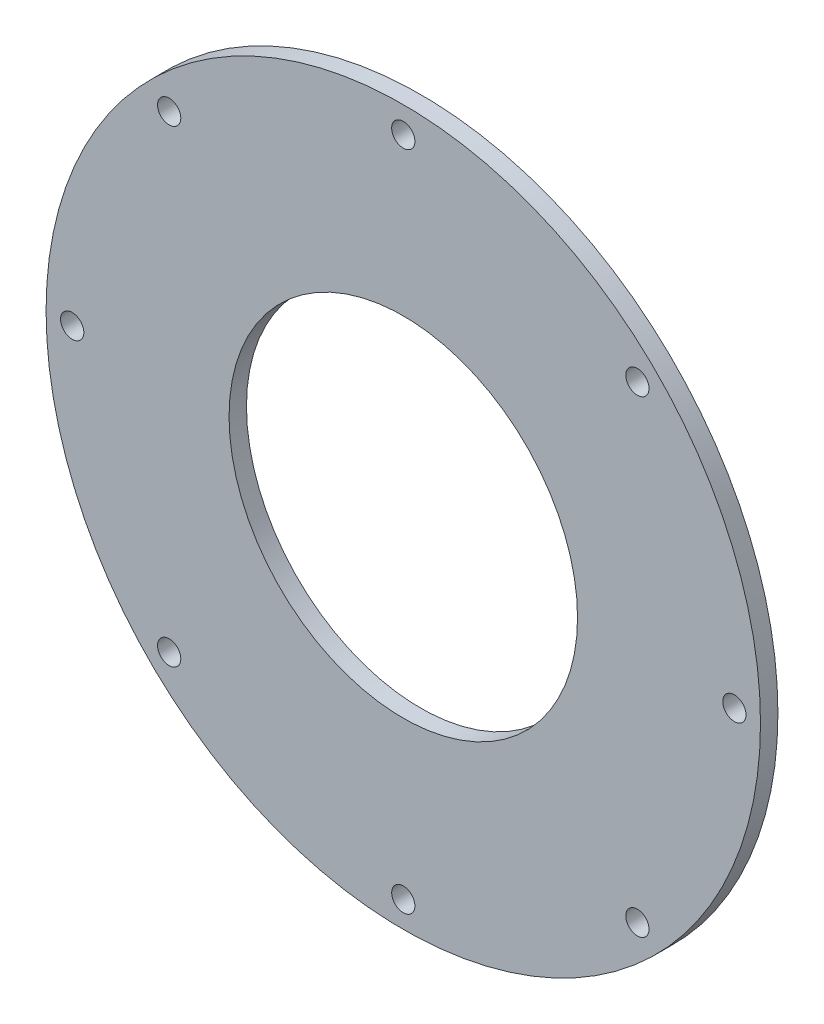
ISO-10303-21;
HEADER;
FILE_DESCRIPTION(('STEP AP214'),'2;1');
FILE_NAME('part.step','',(''),(''),'','','');
FILE_SCHEMA(('AUTOMOTIVE_DESIGN { 1 0 10303 214 1 1 1 1 }'));
ENDSEC;
DATA;
#1=APPLICATION_CONTEXT('core data for automotive mechanical design processes');
#2=APPLICATION_PROTOCOL_DEFINITION('international standard','automotive_design',2000,#1);
#3=PRODUCT_CONTEXT('',#1,'mechanical');
#4=PRODUCT('Part','Part','',(#3));
#5=PRODUCT_RELATED_PRODUCT_CATEGORY('part','',(#4));
#6=PRODUCT_DEFINITION_FORMATION('','',#4);
#7=PRODUCT_DEFINITION_CONTEXT('part definition',#1,'design');
#8=PRODUCT_DEFINITION('design','',#6,#7);
#9=PRODUCT_DEFINITION_SHAPE('','',#8);
#10=(LENGTH_UNIT() NAMED_UNIT(*) SI_UNIT(.MILLI.,.METRE.));
#11=(NAMED_UNIT(*) PLANE_ANGLE_UNIT() SI_UNIT($,.RADIAN.));
#12=(NAMED_UNIT(*) SI_UNIT($,.STERADIAN.) SOLID_ANGLE_UNIT());
#13=UNCERTAINTY_MEASURE_WITH_UNIT(LENGTH_MEASURE(1.E-05),#10,'distance_accuracy_value','');
#14=(GEOMETRIC_REPRESENTATION_CONTEXT(3) GLOBAL_UNCERTAINTY_ASSIGNED_CONTEXT((#13)) GLOBAL_UNIT_ASSIGNED_CONTEXT((#10,
#11,#12)) REPRESENTATION_CONTEXT('',''));
#15=CARTESIAN_POINT('',(0.,0.,0.));
#16=DIRECTION('',(0.,0.,1.));
#17=DIRECTION('',(1.,0.,0.));
#18=AXIS2_PLACEMENT_3D('',#15,#16,#17);
#19=CARTESIAN_POINT('',(0.,0.,3.));
#20=DIRECTION('',(0.,0.,1.));
#21=DIRECTION('',(1.,0.,0.));
#22=AXIS2_PLACEMENT_3D('',#19,#20,#21);
#23=PLANE('',#22);
#24=CARTESIAN_POINT('',(0.,0.,3.));
#25=DIRECTION('',(0.,0.,1.));
#26=DIRECTION('',(1.,0.,0.));
#27=AXIS2_PLACEMENT_3D('',#24,#25,#26);
#28=CIRCLE('',#27,30.);
#29=CARTESIAN_POINT('',(30.,0.,3.));
#30=VERTEX_POINT('',#29);
#31=EDGE_CURVE('E117',#30,#30,#28,.T.);
#32=ORIENTED_EDGE('',*,*,#31,.F.);
#33=EDGE_LOOP('',(#32));
#34=FACE_BOUND('',#33,.T.);
#35=CARTESIAN_POINT('',(57.,-5.96492217882559E-13,3.));
#36=DIRECTION('',(0.,0.,1.));
#37=DIRECTION('',(1.,0.,0.));
#38=AXIS2_PLACEMENT_3D('',#35,#36,#37);
#39=CIRCLE('',#38,2.);
#40=CARTESIAN_POINT('',(59.,-5.96492217882559E-13,3.));
#41=VERTEX_POINT('',#40);
#42=EDGE_CURVE('E98',#41,#41,#39,.T.);
#43=ORIENTED_EDGE('',*,*,#42,.F.);
#44=EDGE_LOOP('',(#43));
#45=FACE_BOUND('',#44,.T.);
#46=CARTESIAN_POINT('',(3.97477781568501E-13,57.,3.));
#47=DIRECTION('',(0.,0.,1.));
#48=DIRECTION('',(1.,0.,0.));
#49=AXIS2_PLACEMENT_3D('',#46,#47,#48);
#50=CIRCLE('',#49,2.);
#51=CARTESIAN_POINT('',(2.0000000000004,57.,3.));
#52=VERTEX_POINT('',#51);
#53=EDGE_CURVE('E82',#52,#52,#50,.T.);
#54=ORIENTED_EDGE('',*,*,#53,.F.);
#55=EDGE_LOOP('',(#54));
#56=FACE_BOUND('',#55,.T.);
#57=CARTESIAN_POINT('',(-57.,1.00835959934104E-12,3.));
#58=DIRECTION('',(0.,0.,1.));
#59=DIRECTION('',(1.,0.,0.));
#60=AXIS2_PLACEMENT_3D('',#57,#58,#59);
#61=CIRCLE('',#60,2.);
#62=CARTESIAN_POINT('',(-55.,1.00835959934104E-12,3.));
#63=VERTEX_POINT('',#62);
#64=EDGE_CURVE('E66',#63,#63,#61,.T.);
#65=ORIENTED_EDGE('',*,*,#64,.F.);
#66=EDGE_LOOP('',(#65));
#67=FACE_BOUND('',#66,.T.);
#68=CARTESIAN_POINT('',(0.,-57.,3.));
#69=DIRECTION('',(0.,0.,1.));
#70=DIRECTION('',(1.,0.,0.));
#71=AXIS2_PLACEMENT_3D('',#68,#69,#70);
#72=CIRCLE('',#71,2.);
#73=CARTESIAN_POINT('',(2.,-57.,3.));
#74=VERTEX_POINT('',#73);
#75=EDGE_CURVE('E52',#74,#74,#72,.T.);
#76=ORIENTED_EDGE('',*,*,#75,.F.);
#77=EDGE_LOOP('',(#76));
#78=FACE_BOUND('',#77,.T.);
#79=CARTESIAN_POINT('',(0.,0.,3.));
#80=DIRECTION('',(0.,0.,1.));
#81=DIRECTION('',(1.,0.,0.));
#82=AXIS2_PLACEMENT_3D('',#79,#80,#81);
#83=CIRCLE('',#82,61.5);
#84=CARTESIAN_POINT('',(61.5,0.,3.));
#85=VERTEX_POINT('',#84);
#86=EDGE_CURVE('E10',#85,#85,#83,.T.);
#87=ORIENTED_EDGE('',*,*,#86,.T.);
#88=EDGE_LOOP('',(#87));
#89=FACE_BOUND('',#88,.T.);
#90=CARTESIAN_POINT('',(-40.3050865276338,-40.3050865276326,3.));
#91=DIRECTION('',(0.,0.,1.));
#92=DIRECTION('',(1.,0.,0.));
#93=AXIS2_PLACEMENT_3D('',#90,#91,#92);
#94=CIRCLE('',#93,2.00000000000001);
#95=CARTESIAN_POINT('',(-38.3050865276338,-40.3050865276326,3.));
#96=VERTEX_POINT('',#95);
#97=EDGE_CURVE('E58',#96,#96,#94,.T.);
#98=ORIENTED_EDGE('',*,*,#97,.F.);
#99=EDGE_LOOP('',(#98));
#100=FACE_BOUND('',#99,.T.);
#101=CARTESIAN_POINT('',(-40.305086527633,40.3050865276334,3.));
#102=DIRECTION('',(0.,0.,1.));
#103=DIRECTION('',(1.,0.,0.));
#104=AXIS2_PLACEMENT_3D('',#101,#102,#103);
#105=CIRCLE('',#104,2.00000000000001);
#106=CARTESIAN_POINT('',(-38.305086527633,40.3050865276334,3.));
#107=VERTEX_POINT('',#106);
#108=EDGE_CURVE('E74',#107,#107,#105,.T.);
#109=ORIENTED_EDGE('',*,*,#108,.F.);
#110=EDGE_LOOP('',(#109));
#111=FACE_BOUND('',#110,.T.);
#112=CARTESIAN_POINT('',(40.3050865276336,40.3050865276329,3.));
#113=DIRECTION('',(0.,0.,1.));
#114=DIRECTION('',(1.,0.,0.));
#115=AXIS2_PLACEMENT_3D('',#112,#113,#114);
#116=CIRCLE('',#115,2.00000000000001);
#117=CARTESIAN_POINT('',(42.3050865276336,40.3050865276329,3.));
#118=VERTEX_POINT('',#117);
#119=EDGE_CURVE('E90',#118,#118,#116,.T.);
#120=ORIENTED_EDGE('',*,*,#119,.F.);
#121=EDGE_LOOP('',(#120));
#122=FACE_BOUND('',#121,.T.);
#123=CARTESIAN_POINT('',(40.3050865276327,-40.3050865276337,3.));
#124=DIRECTION('',(0.,0.,1.));
#125=DIRECTION('',(1.,0.,0.));
#126=AXIS2_PLACEMENT_3D('',#123,#124,#125);
#127=CIRCLE('',#126,2.00000000000001);
#128=CARTESIAN_POINT('',(42.3050865276327,-40.3050865276337,3.));
#129=VERTEX_POINT('',#128);
#130=EDGE_CURVE('E106',#129,#129,#127,.T.);
#131=ORIENTED_EDGE('',*,*,#130,.F.);
#132=EDGE_LOOP('',(#131));
#133=FACE_BOUND('',#132,.T.);
#134=ADVANCED_FACE('F37',(#34,#45,#56,#67,#78,#89,#100,#111,#122,#133),#23,.T.);
#135=CARTESIAN_POINT('',(0.,0.,0.));
#136=DIRECTION('',(0.,0.,1.));
#137=DIRECTION('',(1.,0.,0.));
#138=AXIS2_PLACEMENT_3D('',#135,#136,#137);
#139=PLANE('',#138);
#140=CARTESIAN_POINT('',(0.,0.,0.));
#141=DIRECTION('',(0.,0.,1.));
#142=DIRECTION('',(1.,0.,0.));
#143=AXIS2_PLACEMENT_3D('',#140,#141,#142);
#144=CIRCLE('',#143,30.);
#145=CARTESIAN_POINT('',(30.,0.,0.));
#146=VERTEX_POINT('',#145);
#147=EDGE_CURVE('E41',#146,#146,#144,.T.);
#148=ORIENTED_EDGE('',*,*,#147,.T.);
#149=EDGE_LOOP('',(#148));
#150=FACE_BOUND('',#149,.T.);
#151=CARTESIAN_POINT('',(0.,0.,0.));
#152=DIRECTION('',(0.,0.,1.));
#153=DIRECTION('',(1.,0.,0.));
#154=AXIS2_PLACEMENT_3D('',#151,#152,#153);
#155=CIRCLE('',#154,61.5);
#156=CARTESIAN_POINT('',(61.5,0.,0.));
#157=VERTEX_POINT('',#156);
#158=EDGE_CURVE('E46',#157,#157,#155,.T.);
#159=ORIENTED_EDGE('',*,*,#158,.F.);
#160=EDGE_LOOP('',(#159));
#161=FACE_BOUND('',#160,.T.);
#162=CARTESIAN_POINT('',(0.,-57.,0.));
#163=DIRECTION('',(0.,0.,1.));
#164=DIRECTION('',(1.,0.,0.));
#165=AXIS2_PLACEMENT_3D('',#162,#163,#164);
#166=CIRCLE('',#165,2.);
#167=CARTESIAN_POINT('',(2.,-57.,0.));
#168=VERTEX_POINT('',#167);
#169=EDGE_CURVE('E54',#168,#168,#166,.T.);
#170=ORIENTED_EDGE('',*,*,#169,.T.);
#171=EDGE_LOOP('',(#170));
#172=FACE_BOUND('',#171,.T.);
#173=CARTESIAN_POINT('',(-40.3050865276338,-40.3050865276326,0.));
#174=DIRECTION('',(0.,0.,1.));
#175=DIRECTION('',(1.,0.,0.));
#176=AXIS2_PLACEMENT_3D('',#173,#174,#175);
#177=CIRCLE('',#176,2.00000000000001);
#178=CARTESIAN_POINT('',(-38.3050865276338,-40.3050865276326,0.));
#179=VERTEX_POINT('',#178);
#180=EDGE_CURVE('E62',#179,#179,#177,.T.);
#181=ORIENTED_EDGE('',*,*,#180,.T.);
#182=EDGE_LOOP('',(#181));
#183=FACE_BOUND('',#182,.T.);
#184=CARTESIAN_POINT('',(-57.,1.00835959934104E-12,0.));
#185=DIRECTION('',(0.,0.,1.));
#186=DIRECTION('',(1.,0.,0.));
#187=AXIS2_PLACEMENT_3D('',#184,#185,#186);
#188=CIRCLE('',#187,2.);
#189=CARTESIAN_POINT('',(-55.,1.00835959934104E-12,0.));
#190=VERTEX_POINT('',#189);
#191=EDGE_CURVE('E70',#190,#190,#188,.T.);
#192=ORIENTED_EDGE('',*,*,#191,.T.);
#193=EDGE_LOOP('',(#192));
#194=FACE_BOUND('',#193,.T.);
#195=CARTESIAN_POINT('',(-40.305086527633,40.3050865276334,0.));
#196=DIRECTION('',(0.,0.,1.));
#197=DIRECTION('',(1.,0.,0.));
#198=AXIS2_PLACEMENT_3D('',#195,#196,#197);
#199=CIRCLE('',#198,2.00000000000001);
#200=CARTESIAN_POINT('',(-38.305086527633,40.3050865276334,0.));
#201=VERTEX_POINT('',#200);
#202=EDGE_CURVE('E78',#201,#201,#199,.T.);
#203=ORIENTED_EDGE('',*,*,#202,.T.);
#204=EDGE_LOOP('',(#203));
#205=FACE_BOUND('',#204,.T.);
#206=CARTESIAN_POINT('',(3.97477781568501E-13,57.,0.));
#207=DIRECTION('',(0.,0.,1.));
#208=DIRECTION('',(1.,0.,0.));
#209=AXIS2_PLACEMENT_3D('',#206,#207,#208);
#210=CIRCLE('',#209,2.);
#211=CARTESIAN_POINT('',(2.0000000000004,57.,0.));
#212=VERTEX_POINT('',#211);
#213=EDGE_CURVE('E86',#212,#212,#210,.T.);
#214=ORIENTED_EDGE('',*,*,#213,.T.);
#215=EDGE_LOOP('',(#214));
#216=FACE_BOUND('',#215,.T.);
#217=CARTESIAN_POINT('',(40.3050865276336,40.3050865276329,0.));
#218=DIRECTION('',(0.,0.,1.));
#219=DIRECTION('',(1.,0.,0.));
#220=AXIS2_PLACEMENT_3D('',#217,#218,#219);
#221=CIRCLE('',#220,2.00000000000001);
#222=CARTESIAN_POINT('',(42.3050865276336,40.3050865276329,0.));
#223=VERTEX_POINT('',#222);
#224=EDGE_CURVE('E94',#223,#223,#221,.T.);
#225=ORIENTED_EDGE('',*,*,#224,.T.);
#226=EDGE_LOOP('',(#225));
#227=FACE_BOUND('',#226,.T.);
#228=CARTESIAN_POINT('',(57.,-5.96492217882559E-13,0.));
#229=DIRECTION('',(0.,0.,1.));
#230=DIRECTION('',(1.,0.,0.));
#231=AXIS2_PLACEMENT_3D('',#228,#229,#230);
#232=CIRCLE('',#231,2.);
#233=CARTESIAN_POINT('',(59.,-5.96492217882559E-13,0.));
#234=VERTEX_POINT('',#233);
#235=EDGE_CURVE('E102',#234,#234,#232,.T.);
#236=ORIENTED_EDGE('',*,*,#235,.T.);
#237=EDGE_LOOP('',(#236));
#238=FACE_BOUND('',#237,.T.);
#239=CARTESIAN_POINT('',(40.3050865276327,-40.3050865276337,0.));
#240=DIRECTION('',(0.,0.,1.));
#241=DIRECTION('',(1.,0.,0.));
#242=AXIS2_PLACEMENT_3D('',#239,#240,#241);
#243=CIRCLE('',#242,2.00000000000001);
#244=CARTESIAN_POINT('',(42.3050865276327,-40.3050865276337,0.));
#245=VERTEX_POINT('',#244);
#246=EDGE_CURVE('E110',#245,#245,#243,.T.);
#247=ORIENTED_EDGE('',*,*,#246,.T.);
#248=EDGE_LOOP('',(#247));
#249=FACE_BOUND('',#248,.T.);
#250=ADVANCED_FACE('F126',(#150,#161,#172,#183,#194,#205,#216,#227,#238,#249),#139,.F.);
#251=CARTESIAN_POINT('',(0.,0.,3.));
#252=DIRECTION('',(0.,0.,-1.));
#253=DIRECTION('',(-1.,0.,0.));
#254=AXIS2_PLACEMENT_3D('',#251,#252,#253);
#255=CYLINDRICAL_SURFACE('',#254,61.5);
#256=ORIENTED_EDGE('',*,*,#86,.F.);
#257=EDGE_LOOP('',(#256));
#258=FACE_BOUND('',#257,.T.);
#259=ORIENTED_EDGE('',*,*,#158,.T.);
#260=EDGE_LOOP('',(#259));
#261=FACE_BOUND('',#260,.T.);
#262=ADVANCED_FACE('F39',(#258,#261),#255,.T.);
#263=CARTESIAN_POINT('',(0.,-57.,3.));
#264=DIRECTION('',(0.,0.,-1.));
#265=DIRECTION('',(-1.,0.,0.));
#266=AXIS2_PLACEMENT_3D('',#263,#264,#265);
#267=CYLINDRICAL_SURFACE('',#266,2.);
#268=ORIENTED_EDGE('',*,*,#75,.T.);
#269=EDGE_LOOP('',(#268));
#270=FACE_BOUND('',#269,.T.);
#271=ORIENTED_EDGE('',*,*,#169,.F.);
#272=EDGE_LOOP('',(#271));
#273=FACE_BOUND('',#272,.T.);
#274=ADVANCED_FACE('F147',(#270,#273),#267,.F.);
#275=CARTESIAN_POINT('',(-40.3050865276338,-40.3050865276326,3.));
#276=DIRECTION('',(0.,0.,-1.));
#277=DIRECTION('',(-1.,0.,0.));
#278=AXIS2_PLACEMENT_3D('',#275,#276,#277);
#279=CYLINDRICAL_SURFACE('',#278,2.00000000000001);
#280=ORIENTED_EDGE('',*,*,#97,.T.);
#281=EDGE_LOOP('',(#280));
#282=FACE_BOUND('',#281,.T.);
#283=ORIENTED_EDGE('',*,*,#180,.F.);
#284=EDGE_LOOP('',(#283));
#285=FACE_BOUND('',#284,.T.);
#286=ADVANCED_FACE('F150',(#282,#285),#279,.F.);
#287=CARTESIAN_POINT('',(-57.,1.00835959934104E-12,3.));
#288=DIRECTION('',(0.,0.,-1.));
#289=DIRECTION('',(-1.,0.,0.));
#290=AXIS2_PLACEMENT_3D('',#287,#288,#289);
#291=CYLINDRICAL_SURFACE('',#290,2.);
#292=ORIENTED_EDGE('',*,*,#64,.T.);
#293=EDGE_LOOP('',(#292));
#294=FACE_BOUND('',#293,.T.);
#295=ORIENTED_EDGE('',*,*,#191,.F.);
#296=EDGE_LOOP('',(#295));
#297=FACE_BOUND('',#296,.T.);
#298=ADVANCED_FACE('F154',(#294,#297),#291,.F.);
#299=CARTESIAN_POINT('',(-40.305086527633,40.3050865276334,3.));
#300=DIRECTION('',(0.,0.,-1.));
#301=DIRECTION('',(-1.,0.,0.));
#302=AXIS2_PLACEMENT_3D('',#299,#300,#301);
#303=CYLINDRICAL_SURFACE('',#302,2.00000000000001);
#304=ORIENTED_EDGE('',*,*,#108,.T.);
#305=EDGE_LOOP('',(#304));
#306=FACE_BOUND('',#305,.T.);
#307=ORIENTED_EDGE('',*,*,#202,.F.);
#308=EDGE_LOOP('',(#307));
#309=FACE_BOUND('',#308,.T.);
#310=ADVANCED_FACE('F158',(#306,#309),#303,.F.);
#311=CARTESIAN_POINT('',(3.97477781568501E-13,57.,3.));
#312=DIRECTION('',(0.,0.,-1.));
#313=DIRECTION('',(-1.,0.,0.));
#314=AXIS2_PLACEMENT_3D('',#311,#312,#313);
#315=CYLINDRICAL_SURFACE('',#314,2.);
#316=ORIENTED_EDGE('',*,*,#53,.T.);
#317=EDGE_LOOP('',(#316));
#318=FACE_BOUND('',#317,.T.);
#319=ORIENTED_EDGE('',*,*,#213,.F.);
#320=EDGE_LOOP('',(#319));
#321=FACE_BOUND('',#320,.T.);
#322=ADVANCED_FACE('F162',(#318,#321),#315,.F.);
#323=CARTESIAN_POINT('',(40.3050865276336,40.3050865276329,3.));
#324=DIRECTION('',(0.,0.,-1.));
#325=DIRECTION('',(-1.,0.,0.));
#326=AXIS2_PLACEMENT_3D('',#323,#324,#325);
#327=CYLINDRICAL_SURFACE('',#326,2.00000000000001);
#328=ORIENTED_EDGE('',*,*,#119,.T.);
#329=EDGE_LOOP('',(#328));
#330=FACE_BOUND('',#329,.T.);
#331=ORIENTED_EDGE('',*,*,#224,.F.);
#332=EDGE_LOOP('',(#331));
#333=FACE_BOUND('',#332,.T.);
#334=ADVANCED_FACE('F166',(#330,#333),#327,.F.);
#335=CARTESIAN_POINT('',(57.,-5.96492217882559E-13,3.));
#336=DIRECTION('',(0.,0.,-1.));
#337=DIRECTION('',(-1.,0.,0.));
#338=AXIS2_PLACEMENT_3D('',#335,#336,#337);
#339=CYLINDRICAL_SURFACE('',#338,2.);
#340=ORIENTED_EDGE('',*,*,#42,.T.);
#341=EDGE_LOOP('',(#340));
#342=FACE_BOUND('',#341,.T.);
#343=ORIENTED_EDGE('',*,*,#235,.F.);
#344=EDGE_LOOP('',(#343));
#345=FACE_BOUND('',#344,.T.);
#346=ADVANCED_FACE('F136',(#342,#345),#339,.F.);
#347=CARTESIAN_POINT('',(40.3050865276327,-40.3050865276337,3.));
#348=DIRECTION('',(0.,0.,-1.));
#349=DIRECTION('',(-1.,0.,0.));
#350=AXIS2_PLACEMENT_3D('',#347,#348,#349);
#351=CYLINDRICAL_SURFACE('',#350,2.00000000000001);
#352=ORIENTED_EDGE('',*,*,#130,.T.);
#353=EDGE_LOOP('',(#352));
#354=FACE_BOUND('',#353,.T.);
#355=ORIENTED_EDGE('',*,*,#246,.F.);
#356=EDGE_LOOP('',(#355));
#357=FACE_BOUND('',#356,.T.);
#358=ADVANCED_FACE('F131',(#354,#357),#351,.F.);
#359=CARTESIAN_POINT('',(0.,0.,-7.));
#360=DIRECTION('',(0.,0.,1.));
#361=DIRECTION('',(1.,0.,0.));
#362=AXIS2_PLACEMENT_3D('',#359,#360,#361);
#363=CYLINDRICAL_SURFACE('',#362,30.);
#364=ORIENTED_EDGE('',*,*,#31,.T.);
#365=EDGE_LOOP('',(#364));
#366=FACE_BOUND('',#365,.T.);
#367=ORIENTED_EDGE('',*,*,#147,.F.);
#368=EDGE_LOOP('',(#367));
#369=FACE_BOUND('',#368,.T.);
#370=ADVANCED_FACE('F129',(#366,#369),#363,.F.);
#371=CLOSED_SHELL('',(#134,#250,#262,#274,#286,#298,#310,#322,#334,#346,#358,#370));
#372=MANIFOLD_SOLID_BREP('B2',#371);
#373=ADVANCED_BREP_SHAPE_REPRESENTATION('',(#18,#372),#14);
#374=SHAPE_DEFINITION_REPRESENTATION(#9,#373);
ENDSEC;
END-ISO-10303-21;
